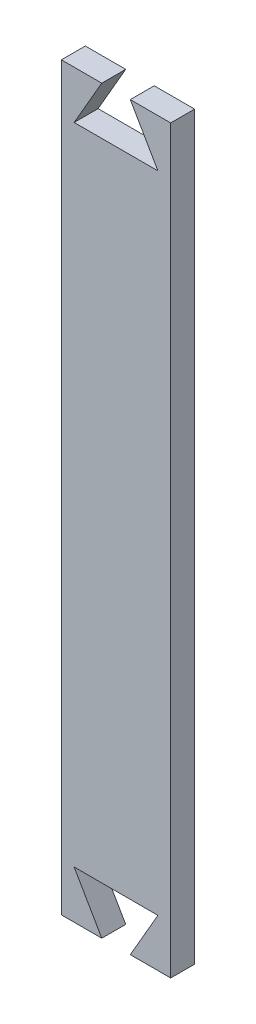
ISO-10303-21;
HEADER;
FILE_DESCRIPTION(('STEP AP214'),'2;1');
FILE_NAME('part.step','',(''),(''),'','','');
FILE_SCHEMA(('AUTOMOTIVE_DESIGN { 1 0 10303 214 1 1 1 1 }'));
ENDSEC;
DATA;
#1=APPLICATION_CONTEXT('core data for automotive mechanical design processes');
#2=APPLICATION_PROTOCOL_DEFINITION('international standard','automotive_design',2000,#1);
#3=PRODUCT_CONTEXT('',#1,'mechanical');
#4=PRODUCT('Part','Part','',(#3));
#5=PRODUCT_RELATED_PRODUCT_CATEGORY('part','',(#4));
#6=PRODUCT_DEFINITION_FORMATION('','',#4);
#7=PRODUCT_DEFINITION_CONTEXT('part definition',#1,'design');
#8=PRODUCT_DEFINITION('design','',#6,#7);
#9=PRODUCT_DEFINITION_SHAPE('','',#8);
#10=(LENGTH_UNIT() NAMED_UNIT(*) SI_UNIT(.MILLI.,.METRE.));
#11=(NAMED_UNIT(*) PLANE_ANGLE_UNIT() SI_UNIT($,.RADIAN.));
#12=(NAMED_UNIT(*) SI_UNIT($,.STERADIAN.) SOLID_ANGLE_UNIT());
#13=UNCERTAINTY_MEASURE_WITH_UNIT(LENGTH_MEASURE(1.E-05),#10,'distance_accuracy_value','');
#14=(GEOMETRIC_REPRESENTATION_CONTEXT(3) GLOBAL_UNCERTAINTY_ASSIGNED_CONTEXT((#13)) GLOBAL_UNIT_ASSIGNED_CONTEXT((#10,
#11,#12)) REPRESENTATION_CONTEXT('',''));
#15=CARTESIAN_POINT('',(0.,0.,0.));
#16=DIRECTION('',(0.,0.,1.));
#17=DIRECTION('',(1.,0.,0.));
#18=AXIS2_PLACEMENT_3D('',#15,#16,#17);
#19=CARTESIAN_POINT('',(-3.02412126503343,0.,5.08));
#20=DIRECTION('',(0.,1.,0.));
#21=DIRECTION('',(0.,0.,1.));
#22=AXIS2_PLACEMENT_3D('',#19,#20,#21);
#23=PLANE('',#22);
#24=DIRECTION('',(1.,0.,0.));
#25=VECTOR('',#24,1.);
#26=CARTESIAN_POINT('',(-3.02412126503343,0.,0.));
#27=LINE('',#26,#25);
#28=CARTESIAN_POINT('',(-11.5976146,0.,0.));
#29=VERTEX_POINT('',#28);
#30=CARTESIAN_POINT('',(-3.02412126503343,0.,0.));
#31=VERTEX_POINT('',#30);
#32=EDGE_CURVE('E168',#29,#31,#27,.T.);
#33=ORIENTED_EDGE('',*,*,#32,.T.);
#34=DIRECTION('',(0.,0.,-1.));
#35=VECTOR('',#34,1.);
#36=CARTESIAN_POINT('',(-3.02412126503343,0.,5.08));
#37=LINE('',#36,#35);
#38=CARTESIAN_POINT('',(-3.02412126503343,0.,5.08));
#39=VERTEX_POINT('',#38);
#40=EDGE_CURVE('E11',#39,#31,#37,.T.);
#41=ORIENTED_EDGE('',*,*,#40,.F.);
#42=DIRECTION('',(1.,0.,0.));
#43=VECTOR('',#42,1.);
#44=CARTESIAN_POINT('',(-3.02412126503343,0.,5.08));
#45=LINE('',#44,#43);
#46=CARTESIAN_POINT('',(-11.5976146,0.,5.08));
#47=VERTEX_POINT('',#46);
#48=EDGE_CURVE('E202',#47,#39,#45,.T.);
#49=ORIENTED_EDGE('',*,*,#48,.F.);
#50=DIRECTION('',(0.,0.,-1.));
#51=VECTOR('',#50,1.);
#52=CARTESIAN_POINT('',(-11.5976146,0.,5.08));
#53=LINE('',#52,#51);
#54=EDGE_CURVE('E164',#47,#29,#53,.T.);
#55=ORIENTED_EDGE('',*,*,#54,.T.);
#56=EDGE_LOOP('',(#33,#41,#49,#55));
#57=FACE_BOUND('',#56,.T.);
#58=ADVANCED_FACE('F43',(#57),#23,.F.);
#59=CARTESIAN_POINT('',(-3.02412126503343,0.,5.08));
#60=DIRECTION('',(-0.86602540378444,-0.499999999999998,0.));
#61=DIRECTION('',(0.499999999999998,-0.86602540378444,0.));
#62=AXIS2_PLACEMENT_3D('',#59,#60,#61);
#63=PLANE('',#62);
#64=DIRECTION('',(-0.499999999999998,0.86602540378444,0.));
#65=VECTOR('',#64,1.);
#66=CARTESIAN_POINT('',(-3.02412126503343,0.,0.));
#67=LINE('',#66,#65);
#68=CARTESIAN_POINT('',(-8.89,10.16,0.));
#69=VERTEX_POINT('',#68);
#70=EDGE_CURVE('E172',#31,#69,#67,.T.);
#71=ORIENTED_EDGE('',*,*,#70,.T.);
#72=DIRECTION('',(0.,0.,-1.));
#73=VECTOR('',#72,1.);
#74=CARTESIAN_POINT('',(-8.89,10.16,5.08));
#75=LINE('',#74,#73);
#76=CARTESIAN_POINT('',(-8.89,10.16,5.08));
#77=VERTEX_POINT('',#76);
#78=EDGE_CURVE('E52',#77,#69,#75,.T.);
#79=ORIENTED_EDGE('',*,*,#78,.F.);
#80=DIRECTION('',(-0.499999999999998,0.86602540378444,0.));
#81=VECTOR('',#80,1.);
#82=CARTESIAN_POINT('',(-3.02412126503343,0.,5.08));
#83=LINE('',#82,#81);
#84=EDGE_CURVE('E115',#39,#77,#83,.T.);
#85=ORIENTED_EDGE('',*,*,#84,.F.);
#86=ORIENTED_EDGE('',*,*,#40,.T.);
#87=EDGE_LOOP('',(#71,#79,#85,#86));
#88=FACE_BOUND('',#87,.T.);
#89=ADVANCED_FACE('F296',(#88),#63,.F.);
#90=CARTESIAN_POINT('',(-8.89,10.16,5.08));
#91=DIRECTION('',(0.,1.,0.));
#92=DIRECTION('',(0.,0.,1.));
#93=AXIS2_PLACEMENT_3D('',#90,#91,#92);
#94=PLANE('',#93);
#95=DIRECTION('',(1.,0.,0.));
#96=VECTOR('',#95,1.);
#97=CARTESIAN_POINT('',(-8.89,10.16,0.));
#98=LINE('',#97,#96);
#99=CARTESIAN_POINT('',(8.89,10.16,0.));
#100=VERTEX_POINT('',#99);
#101=EDGE_CURVE('E175',#69,#100,#98,.T.);
#102=ORIENTED_EDGE('',*,*,#101,.T.);
#103=DIRECTION('',(0.,0.,-1.));
#104=VECTOR('',#103,1.);
#105=CARTESIAN_POINT('',(8.89,10.16,5.08));
#106=LINE('',#105,#104);
#107=CARTESIAN_POINT('',(8.89,10.16,5.08));
#108=VERTEX_POINT('',#107);
#109=EDGE_CURVE('E229',#108,#100,#106,.T.);
#110=ORIENTED_EDGE('',*,*,#109,.F.);
#111=DIRECTION('',(1.,0.,0.));
#112=VECTOR('',#111,1.);
#113=CARTESIAN_POINT('',(-8.89,10.16,5.08));
#114=LINE('',#113,#112);
#115=EDGE_CURVE('E239',#77,#108,#114,.T.);
#116=ORIENTED_EDGE('',*,*,#115,.F.);
#117=ORIENTED_EDGE('',*,*,#78,.T.);
#118=EDGE_LOOP('',(#102,#110,#116,#117));
#119=FACE_BOUND('',#118,.T.);
#120=ADVANCED_FACE('F237',(#119),#94,.F.);
#121=CARTESIAN_POINT('',(8.89,10.16,5.08));
#122=DIRECTION('',(0.866025403784436,-0.500000000000004,0.));
#123=DIRECTION('',(0.500000000000004,0.866025403784436,0.));
#124=AXIS2_PLACEMENT_3D('',#121,#122,#123);
#125=PLANE('',#124);
#126=DIRECTION('',(-0.500000000000004,-0.866025403784436,0.));
#127=VECTOR('',#126,1.);
#128=CARTESIAN_POINT('',(8.89,10.16,0.));
#129=LINE('',#128,#127);
#130=CARTESIAN_POINT('',(3.02412126503334,0.,0.));
#131=VERTEX_POINT('',#130);
#132=EDGE_CURVE('E178',#100,#131,#129,.T.);
#133=ORIENTED_EDGE('',*,*,#132,.T.);
#134=DIRECTION('',(0.,0.,-1.));
#135=VECTOR('',#134,1.);
#136=CARTESIAN_POINT('',(3.02412126503334,0.,5.08));
#137=LINE('',#136,#135);
#138=CARTESIAN_POINT('',(3.02412126503334,0.,5.08));
#139=VERTEX_POINT('',#138);
#140=EDGE_CURVE('E225',#139,#131,#137,.T.);
#141=ORIENTED_EDGE('',*,*,#140,.F.);
#142=DIRECTION('',(-0.500000000000004,-0.866025403784436,0.));
#143=VECTOR('',#142,1.);
#144=CARTESIAN_POINT('',(8.89,10.16,5.08));
#145=LINE('',#144,#143);
#146=EDGE_CURVE('E258',#108,#139,#145,.T.);
#147=ORIENTED_EDGE('',*,*,#146,.F.);
#148=ORIENTED_EDGE('',*,*,#109,.T.);
#149=EDGE_LOOP('',(#133,#141,#147,#148));
#150=FACE_BOUND('',#149,.T.);
#151=ADVANCED_FACE('F248',(#150),#125,.F.);
#152=CARTESIAN_POINT('',(3.02412126503334,0.,5.08));
#153=DIRECTION('',(0.,1.,0.));
#154=DIRECTION('',(0.,0.,1.));
#155=AXIS2_PLACEMENT_3D('',#152,#153,#154);
#156=PLANE('',#155);
#157=DIRECTION('',(1.,0.,0.));
#158=VECTOR('',#157,1.);
#159=CARTESIAN_POINT('',(3.02412126503334,0.,0.));
#160=LINE('',#159,#158);
#161=CARTESIAN_POINT('',(11.5976146,0.,0.));
#162=VERTEX_POINT('',#161);
#163=EDGE_CURVE('E181',#131,#162,#160,.T.);
#164=ORIENTED_EDGE('',*,*,#163,.T.);
#165=DIRECTION('',(0.,0.,-1.));
#166=VECTOR('',#165,1.);
#167=CARTESIAN_POINT('',(11.5976146,0.,5.08));
#168=LINE('',#167,#166);
#169=CARTESIAN_POINT('',(11.5976146,0.,5.08));
#170=VERTEX_POINT('',#169);
#171=EDGE_CURVE('E221',#170,#162,#168,.T.);
#172=ORIENTED_EDGE('',*,*,#171,.F.);
#173=DIRECTION('',(1.,0.,0.));
#174=VECTOR('',#173,1.);
#175=CARTESIAN_POINT('',(3.02412126503334,0.,5.08));
#176=LINE('',#175,#174);
#177=EDGE_CURVE('E254',#139,#170,#176,.T.);
#178=ORIENTED_EDGE('',*,*,#177,.F.);
#179=ORIENTED_EDGE('',*,*,#140,.T.);
#180=EDGE_LOOP('',(#164,#172,#178,#179));
#181=FACE_BOUND('',#180,.T.);
#182=ADVANCED_FACE('F252',(#181),#156,.F.);
#183=CARTESIAN_POINT('',(11.5976146,0.,5.08));
#184=DIRECTION('',(-1.,0.,0.));
#185=DIRECTION('',(0.,-1.,0.));
#186=AXIS2_PLACEMENT_3D('',#183,#184,#185);
#187=PLANE('',#186);
#188=DIRECTION('',(0.,1.,0.));
#189=VECTOR('',#188,1.);
#190=CARTESIAN_POINT('',(11.5976146,0.,0.));
#191=LINE('',#190,#189);
#192=CARTESIAN_POINT('',(11.5976146,157.1625,0.));
#193=VERTEX_POINT('',#192);
#194=EDGE_CURVE('E184',#162,#193,#191,.T.);
#195=ORIENTED_EDGE('',*,*,#194,.T.);
#196=DIRECTION('',(0.,0.,-1.));
#197=VECTOR('',#196,1.);
#198=CARTESIAN_POINT('',(11.5976146,157.1625,5.08));
#199=LINE('',#198,#197);
#200=CARTESIAN_POINT('',(11.5976146,157.1625,5.08));
#201=VERTEX_POINT('',#200);
#202=EDGE_CURVE('E217',#201,#193,#199,.T.);
#203=ORIENTED_EDGE('',*,*,#202,.F.);
#204=DIRECTION('',(0.,1.,0.));
#205=VECTOR('',#204,1.);
#206=CARTESIAN_POINT('',(11.5976146,0.,5.08));
#207=LINE('',#206,#205);
#208=EDGE_CURVE('E257',#170,#201,#207,.T.);
#209=ORIENTED_EDGE('',*,*,#208,.F.);
#210=ORIENTED_EDGE('',*,*,#171,.T.);
#211=EDGE_LOOP('',(#195,#203,#209,#210));
#212=FACE_BOUND('',#211,.T.);
#213=ADVANCED_FACE('F309',(#212),#187,.F.);
#214=CARTESIAN_POINT('',(11.5976146,157.1625,5.08));
#215=DIRECTION('',(0.,-1.,0.));
#216=DIRECTION('',(0.,0.,-1.));
#217=AXIS2_PLACEMENT_3D('',#214,#215,#216);
#218=PLANE('',#217);
#219=DIRECTION('',(-1.,0.,0.));
#220=VECTOR('',#219,1.);
#221=CARTESIAN_POINT('',(11.5976146,157.1625,0.));
#222=LINE('',#221,#220);
#223=CARTESIAN_POINT('',(3.02412126503334,157.1625,0.));
#224=VERTEX_POINT('',#223);
#225=EDGE_CURVE('E187',#193,#224,#222,.T.);
#226=ORIENTED_EDGE('',*,*,#225,.T.);
#227=DIRECTION('',(0.,0.,-1.));
#228=VECTOR('',#227,1.);
#229=CARTESIAN_POINT('',(3.02412126503334,157.1625,5.08));
#230=LINE('',#229,#228);
#231=CARTESIAN_POINT('',(3.02412126503334,157.1625,5.08));
#232=VERTEX_POINT('',#231);
#233=EDGE_CURVE('E213',#232,#224,#230,.T.);
#234=ORIENTED_EDGE('',*,*,#233,.F.);
#235=DIRECTION('',(-1.,0.,0.));
#236=VECTOR('',#235,1.);
#237=CARTESIAN_POINT('',(11.5976146,157.1625,5.08));
#238=LINE('',#237,#236);
#239=EDGE_CURVE('E262',#201,#232,#238,.T.);
#240=ORIENTED_EDGE('',*,*,#239,.F.);
#241=ORIENTED_EDGE('',*,*,#202,.T.);
#242=EDGE_LOOP('',(#226,#234,#240,#241));
#243=FACE_BOUND('',#242,.T.);
#244=ADVANCED_FACE('F312',(#243),#218,.F.);
#245=CARTESIAN_POINT('',(8.89,147.0025,5.08));
#246=DIRECTION('',(0.866025403784436,0.500000000000004,0.));
#247=DIRECTION('',(-0.500000000000004,0.866025403784436,0.));
#248=AXIS2_PLACEMENT_3D('',#245,#246,#247);
#249=PLANE('',#248);
#250=DIRECTION('',(0.500000000000004,-0.866025403784436,0.));
#251=VECTOR('',#250,1.);
#252=CARTESIAN_POINT('',(8.89,147.0025,0.));
#253=LINE('',#252,#251);
#254=CARTESIAN_POINT('',(8.89,147.0025,0.));
#255=VERTEX_POINT('',#254);
#256=EDGE_CURVE('E190',#224,#255,#253,.T.);
#257=ORIENTED_EDGE('',*,*,#256,.T.);
#258=DIRECTION('',(0.,0.,-1.));
#259=VECTOR('',#258,1.);
#260=CARTESIAN_POINT('',(8.89,147.0025,5.08));
#261=LINE('',#260,#259);
#262=CARTESIAN_POINT('',(8.89,147.0025,5.08));
#263=VERTEX_POINT('',#262);
#264=EDGE_CURVE('E209',#263,#255,#261,.T.);
#265=ORIENTED_EDGE('',*,*,#264,.F.);
#266=DIRECTION('',(0.500000000000004,-0.866025403784436,0.));
#267=VECTOR('',#266,1.);
#268=CARTESIAN_POINT('',(8.89,147.0025,5.08));
#269=LINE('',#268,#267);
#270=EDGE_CURVE('E269',#232,#263,#269,.T.);
#271=ORIENTED_EDGE('',*,*,#270,.F.);
#272=ORIENTED_EDGE('',*,*,#233,.T.);
#273=EDGE_LOOP('',(#257,#265,#271,#272));
#274=FACE_BOUND('',#273,.T.);
#275=ADVANCED_FACE('F277',(#274),#249,.F.);
#276=CARTESIAN_POINT('',(-8.89,147.0025,5.08));
#277=DIRECTION('',(0.,-1.,0.));
#278=DIRECTION('',(0.,0.,-1.));
#279=AXIS2_PLACEMENT_3D('',#276,#277,#278);
#280=PLANE('',#279);
#281=DIRECTION('',(-1.,0.,0.));
#282=VECTOR('',#281,1.);
#283=CARTESIAN_POINT('',(-8.89,147.0025,0.));
#284=LINE('',#283,#282);
#285=CARTESIAN_POINT('',(-8.89,147.0025,0.));
#286=VERTEX_POINT('',#285);
#287=EDGE_CURVE('E193',#255,#286,#284,.T.);
#288=ORIENTED_EDGE('',*,*,#287,.T.);
#289=DIRECTION('',(0.,0.,-1.));
#290=VECTOR('',#289,1.);
#291=CARTESIAN_POINT('',(-8.89,147.0025,5.08));
#292=LINE('',#291,#290);
#293=CARTESIAN_POINT('',(-8.89,147.0025,5.08));
#294=VERTEX_POINT('',#293);
#295=EDGE_CURVE('E157',#294,#286,#292,.T.);
#296=ORIENTED_EDGE('',*,*,#295,.F.);
#297=DIRECTION('',(-1.,0.,0.));
#298=VECTOR('',#297,1.);
#299=CARTESIAN_POINT('',(-8.89,147.0025,5.08));
#300=LINE('',#299,#298);
#301=EDGE_CURVE('E146',#263,#294,#300,.T.);
#302=ORIENTED_EDGE('',*,*,#301,.F.);
#303=ORIENTED_EDGE('',*,*,#264,.T.);
#304=EDGE_LOOP('',(#288,#296,#302,#303));
#305=FACE_BOUND('',#304,.T.);
#306=ADVANCED_FACE('F281',(#305),#280,.F.);
#307=CARTESIAN_POINT('',(-3.02412126503343,157.1625,5.08));
#308=DIRECTION('',(-0.86602540378444,0.499999999999998,0.));
#309=DIRECTION('',(-0.499999999999998,-0.86602540378444,0.));
#310=AXIS2_PLACEMENT_3D('',#307,#308,#309);
#311=PLANE('',#310);
#312=DIRECTION('',(0.499999999999998,0.86602540378444,0.));
#313=VECTOR('',#312,1.);
#314=CARTESIAN_POINT('',(-3.02412126503343,157.1625,0.));
#315=LINE('',#314,#313);
#316=CARTESIAN_POINT('',(-3.02412126503343,157.1625,0.));
#317=VERTEX_POINT('',#316);
#318=EDGE_CURVE('E155',#286,#317,#315,.T.);
#319=ORIENTED_EDGE('',*,*,#318,.T.);
#320=DIRECTION('',(0.,0.,-1.));
#321=VECTOR('',#320,1.);
#322=CARTESIAN_POINT('',(-3.02412126503343,157.1625,5.08));
#323=LINE('',#322,#321);
#324=CARTESIAN_POINT('',(-3.02412126503343,157.1625,5.08));
#325=VERTEX_POINT('',#324);
#326=EDGE_CURVE('E152',#325,#317,#323,.T.);
#327=ORIENTED_EDGE('',*,*,#326,.F.);
#328=DIRECTION('',(0.499999999999998,0.86602540378444,0.));
#329=VECTOR('',#328,1.);
#330=CARTESIAN_POINT('',(-3.02412126503343,157.1625,5.08));
#331=LINE('',#330,#329);
#332=EDGE_CURVE('E140',#294,#325,#331,.T.);
#333=ORIENTED_EDGE('',*,*,#332,.F.);
#334=ORIENTED_EDGE('',*,*,#295,.T.);
#335=EDGE_LOOP('',(#319,#327,#333,#334));
#336=FACE_BOUND('',#335,.T.);
#337=ADVANCED_FACE('F153',(#336),#311,.F.);
#338=CARTESIAN_POINT('',(-3.02412126503343,157.1625,5.08));
#339=DIRECTION('',(0.,-1.,0.));
#340=DIRECTION('',(0.,0.,-1.));
#341=AXIS2_PLACEMENT_3D('',#338,#339,#340);
#342=PLANE('',#341);
#343=DIRECTION('',(-1.,0.,0.));
#344=VECTOR('',#343,1.);
#345=CARTESIAN_POINT('',(-3.02412126503343,157.1625,0.));
#346=LINE('',#345,#344);
#347=CARTESIAN_POINT('',(-11.5976146,157.1625,0.));
#348=VERTEX_POINT('',#347);
#349=EDGE_CURVE('E101',#317,#348,#346,.T.);
#350=ORIENTED_EDGE('',*,*,#349,.T.);
#351=DIRECTION('',(0.,0.,-1.));
#352=VECTOR('',#351,1.);
#353=CARTESIAN_POINT('',(-11.5976146,157.1625,5.08));
#354=LINE('',#353,#352);
#355=CARTESIAN_POINT('',(-11.5976146,157.1625,5.08));
#356=VERTEX_POINT('',#355);
#357=EDGE_CURVE('E158',#356,#348,#354,.T.);
#358=ORIENTED_EDGE('',*,*,#357,.F.);
#359=DIRECTION('',(-1.,0.,0.));
#360=VECTOR('',#359,1.);
#361=CARTESIAN_POINT('',(-3.02412126503343,157.1625,5.08));
#362=LINE('',#361,#360);
#363=EDGE_CURVE('E144',#325,#356,#362,.T.);
#364=ORIENTED_EDGE('',*,*,#363,.F.);
#365=ORIENTED_EDGE('',*,*,#326,.T.);
#366=EDGE_LOOP('',(#350,#358,#364,#365));
#367=FACE_BOUND('',#366,.T.);
#368=ADVANCED_FACE('F160',(#367),#342,.F.);
#369=CARTESIAN_POINT('',(-11.5976146,0.,5.08));
#370=DIRECTION('',(1.,0.,0.));
#371=DIRECTION('',(0.,1.,0.));
#372=AXIS2_PLACEMENT_3D('',#369,#370,#371);
#373=PLANE('',#372);
#374=DIRECTION('',(0.,-1.,0.));
#375=VECTOR('',#374,1.);
#376=CARTESIAN_POINT('',(-11.5976146,0.,0.));
#377=LINE('',#376,#375);
#378=EDGE_CURVE('E107',#348,#29,#377,.T.);
#379=ORIENTED_EDGE('',*,*,#378,.T.);
#380=ORIENTED_EDGE('',*,*,#54,.F.);
#381=DIRECTION('',(0.,-1.,0.));
#382=VECTOR('',#381,1.);
#383=CARTESIAN_POINT('',(-11.5976146,0.,5.08));
#384=LINE('',#383,#382);
#385=EDGE_CURVE('E60',#356,#47,#384,.T.);
#386=ORIENTED_EDGE('',*,*,#385,.F.);
#387=ORIENTED_EDGE('',*,*,#357,.T.);
#388=EDGE_LOOP('',(#379,#380,#386,#387));
#389=FACE_BOUND('',#388,.T.);
#390=ADVANCED_FACE('F285',(#389),#373,.F.);
#391=CARTESIAN_POINT('',(0.,0.,5.08));
#392=DIRECTION('',(0.,0.,-1.));
#393=DIRECTION('',(-1.,0.,0.));
#394=AXIS2_PLACEMENT_3D('',#391,#392,#393);
#395=PLANE('',#394);
#396=ORIENTED_EDGE('',*,*,#48,.T.);
#397=ORIENTED_EDGE('',*,*,#84,.T.);
#398=ORIENTED_EDGE('',*,*,#115,.T.);
#399=ORIENTED_EDGE('',*,*,#146,.T.);
#400=ORIENTED_EDGE('',*,*,#177,.T.);
#401=ORIENTED_EDGE('',*,*,#208,.T.);
#402=ORIENTED_EDGE('',*,*,#239,.T.);
#403=ORIENTED_EDGE('',*,*,#270,.T.);
#404=ORIENTED_EDGE('',*,*,#301,.T.);
#405=ORIENTED_EDGE('',*,*,#332,.T.);
#406=ORIENTED_EDGE('',*,*,#363,.T.);
#407=ORIENTED_EDGE('',*,*,#385,.T.);
#408=EDGE_LOOP('',(#396,#397,#398,#399,#400,#401,#402,#403,#404,#405,#406,#407));
#409=FACE_BOUND('',#408,.T.);
#410=ADVANCED_FACE('F142',(#409),#395,.F.);
#411=CARTESIAN_POINT('',(0.,0.,0.));
#412=DIRECTION('',(0.,0.,-1.));
#413=DIRECTION('',(-1.,0.,0.));
#414=AXIS2_PLACEMENT_3D('',#411,#412,#413);
#415=PLANE('',#414);
#416=ORIENTED_EDGE('',*,*,#32,.F.);
#417=ORIENTED_EDGE('',*,*,#378,.F.);
#418=ORIENTED_EDGE('',*,*,#349,.F.);
#419=ORIENTED_EDGE('',*,*,#318,.F.);
#420=ORIENTED_EDGE('',*,*,#287,.F.);
#421=ORIENTED_EDGE('',*,*,#256,.F.);
#422=ORIENTED_EDGE('',*,*,#225,.F.);
#423=ORIENTED_EDGE('',*,*,#194,.F.);
#424=ORIENTED_EDGE('',*,*,#163,.F.);
#425=ORIENTED_EDGE('',*,*,#132,.F.);
#426=ORIENTED_EDGE('',*,*,#101,.F.);
#427=ORIENTED_EDGE('',*,*,#70,.F.);
#428=EDGE_LOOP('',(#416,#417,#418,#419,#420,#421,#422,#423,#424,#425,#426,#427));
#429=FACE_BOUND('',#428,.T.);
#430=ADVANCED_FACE('F243',(#429),#415,.T.);
#431=CLOSED_SHELL('',(#58,#89,#120,#151,#182,#213,#244,#275,#306,#337,#368,#390,#410,#430));
#432=MANIFOLD_SOLID_BREP('B2',#431);
#433=ADVANCED_BREP_SHAPE_REPRESENTATION('',(#18,#432),#14);
#434=SHAPE_DEFINITION_REPRESENTATION(#9,#433);
ENDSEC;
END-ISO-10303-21;
